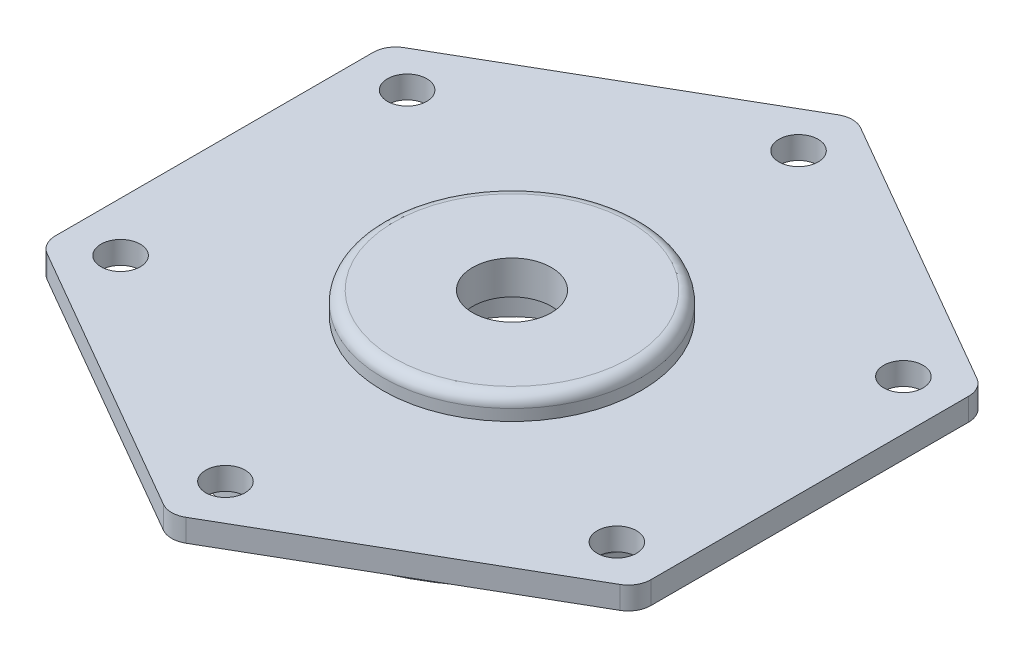
ISO-10303-21;
HEADER;
FILE_DESCRIPTION(('STEP AP214'),'2;1');
FILE_NAME('part.step','',(''),(''),'','','');
FILE_SCHEMA(('AUTOMOTIVE_DESIGN { 1 0 10303 214 1 1 1 1 }'));
ENDSEC;
DATA;
#1=APPLICATION_CONTEXT('core data for automotive mechanical design processes');
#2=APPLICATION_PROTOCOL_DEFINITION('international standard','automotive_design',2000,#1);
#3=PRODUCT_CONTEXT('',#1,'mechanical');
#4=PRODUCT('Part','Part','',(#3));
#5=PRODUCT_RELATED_PRODUCT_CATEGORY('part','',(#4));
#6=PRODUCT_DEFINITION_FORMATION('','',#4);
#7=PRODUCT_DEFINITION_CONTEXT('part definition',#1,'design');
#8=PRODUCT_DEFINITION('design','',#6,#7);
#9=PRODUCT_DEFINITION_SHAPE('','',#8);
#10=(LENGTH_UNIT() NAMED_UNIT(*) SI_UNIT(.MILLI.,.METRE.));
#11=(NAMED_UNIT(*) PLANE_ANGLE_UNIT() SI_UNIT($,.RADIAN.));
#12=(NAMED_UNIT(*) SI_UNIT($,.STERADIAN.) SOLID_ANGLE_UNIT());
#13=UNCERTAINTY_MEASURE_WITH_UNIT(LENGTH_MEASURE(1.E-05),#10,'distance_accuracy_value','');
#14=(GEOMETRIC_REPRESENTATION_CONTEXT(3) GLOBAL_UNCERTAINTY_ASSIGNED_CONTEXT((#13)) GLOBAL_UNIT_ASSIGNED_CONTEXT((#10,
#11,#12)) REPRESENTATION_CONTEXT('',''));
#15=CARTESIAN_POINT('',(0.,0.,0.));
#16=DIRECTION('',(0.,0.,1.));
#17=DIRECTION('',(1.,0.,0.));
#18=AXIS2_PLACEMENT_3D('',#15,#16,#17);
#19=CARTESIAN_POINT('',(-49.,4.,28.2901631902916));
#20=DIRECTION('',(0.,-1.,0.));
#21=DIRECTION('',(0.,0.,-1.));
#22=AXIS2_PLACEMENT_3D('',#19,#20,#21);
#23=CYLINDRICAL_SURFACE('',#22,4.);
#24=CARTESIAN_POINT('',(-49.,0.,28.2901631902916));
#25=DIRECTION('',(0.,1.,0.));
#26=DIRECTION('',(0.,0.,-1.));
#27=AXIS2_PLACEMENT_3D('',#24,#25,#26);
#28=CIRCLE('',#27,4.);
#29=CARTESIAN_POINT('',(-53.,0.,28.2901631902916));
#30=VERTEX_POINT('',#29);
#31=CARTESIAN_POINT('',(-51.,0.,31.7542648054294));
#32=VERTEX_POINT('',#31);
#33=EDGE_CURVE('E161',#30,#32,#28,.T.);
#34=ORIENTED_EDGE('',*,*,#33,.T.);
#35=DIRECTION('',(0.,-1.,0.));
#36=VECTOR('',#35,1.);
#37=CARTESIAN_POINT('',(-51.,4.,31.7542648054294));
#38=LINE('',#37,#36);
#39=CARTESIAN_POINT('',(-51.,4.,31.7542648054294));
#40=VERTEX_POINT('',#39);
#41=EDGE_CURVE('E209',#40,#32,#38,.T.);
#42=ORIENTED_EDGE('',*,*,#41,.F.);
#43=CARTESIAN_POINT('',(-49.,4.,28.2901631902916));
#44=DIRECTION('',(0.,1.,0.));
#45=DIRECTION('',(0.,0.,-1.));
#46=AXIS2_PLACEMENT_3D('',#43,#44,#45);
#47=CIRCLE('',#46,4.);
#48=CARTESIAN_POINT('',(-53.,4.,28.2901631902916));
#49=VERTEX_POINT('',#48);
#50=EDGE_CURVE('E184',#49,#40,#47,.T.);
#51=ORIENTED_EDGE('',*,*,#50,.F.);
#52=DIRECTION('',(0.,-1.,0.));
#53=VECTOR('',#52,1.);
#54=CARTESIAN_POINT('',(-53.,4.,28.2901631902916));
#55=LINE('',#54,#53);
#56=EDGE_CURVE('E157',#49,#30,#55,.T.);
#57=ORIENTED_EDGE('',*,*,#56,.T.);
#58=EDGE_LOOP('',(#34,#42,#51,#57));
#59=FACE_BOUND('',#58,.T.);
#60=ADVANCED_FACE('F37',(#59),#23,.T.);
#61=CARTESIAN_POINT('',(-51.,4.,31.7542648054294));
#62=DIRECTION('',(0.5,0.,-0.866025403784439));
#63=DIRECTION('',(-0.866025403784439,0.,-0.5));
#64=AXIS2_PLACEMENT_3D('',#61,#62,#63);
#65=PLANE('',#64);
#66=DIRECTION('',(0.866025403784438,0.,0.5));
#67=VECTOR('',#66,1.);
#68=CARTESIAN_POINT('',(-51.,0.,31.7542648054294));
#69=LINE('',#68,#67);
#70=CARTESIAN_POINT('',(-2.00000000000003,0.,60.0444279957211));
#71=VERTEX_POINT('',#70);
#72=EDGE_CURVE('E164',#32,#71,#69,.T.);
#73=ORIENTED_EDGE('',*,*,#72,.T.);
#74=DIRECTION('',(0.,-1.,0.));
#75=VECTOR('',#74,1.);
#76=CARTESIAN_POINT('',(-2.00000000000003,4.,60.0444279957211));
#77=LINE('',#76,#75);
#78=CARTESIAN_POINT('',(-2.00000000000003,4.,60.0444279957211));
#79=VERTEX_POINT('',#78);
#80=EDGE_CURVE('E206',#79,#71,#77,.T.);
#81=ORIENTED_EDGE('',*,*,#80,.F.);
#82=DIRECTION('',(0.866025403784438,0.,0.5));
#83=VECTOR('',#82,1.);
#84=CARTESIAN_POINT('',(-51.,4.,31.7542648054294));
#85=LINE('',#84,#83);
#86=EDGE_CURVE('E112',#40,#79,#85,.T.);
#87=ORIENTED_EDGE('',*,*,#86,.F.);
#88=ORIENTED_EDGE('',*,*,#41,.T.);
#89=EDGE_LOOP('',(#73,#81,#87,#88));
#90=FACE_BOUND('',#89,.T.);
#91=ADVANCED_FACE('F316',(#90),#65,.F.);
#92=CARTESIAN_POINT('',(0.,4.,56.5803263805833));
#93=DIRECTION('',(0.,-1.,0.));
#94=DIRECTION('',(0.,0.,-1.));
#95=AXIS2_PLACEMENT_3D('',#92,#93,#94);
#96=CYLINDRICAL_SURFACE('',#95,4.);
#97=CARTESIAN_POINT('',(0.,0.,56.5803263805833));
#98=DIRECTION('',(0.,1.,0.));
#99=DIRECTION('',(0.,0.,1.));
#100=AXIS2_PLACEMENT_3D('',#97,#98,#99);
#101=CIRCLE('',#100,4.);
#102=CARTESIAN_POINT('',(2.,0.,60.0444279957211));
#103=VERTEX_POINT('',#102);
#104=EDGE_CURVE('E167',#71,#103,#101,.T.);
#105=ORIENTED_EDGE('',*,*,#104,.T.);
#106=DIRECTION('',(0.,-1.,0.));
#107=VECTOR('',#106,1.);
#108=CARTESIAN_POINT('',(2.,4.,60.0444279957211));
#109=LINE('',#108,#107);
#110=CARTESIAN_POINT('',(2.,4.,60.0444279957211));
#111=VERTEX_POINT('',#110);
#112=EDGE_CURVE('E203',#111,#103,#109,.T.);
#113=ORIENTED_EDGE('',*,*,#112,.F.);
#114=CARTESIAN_POINT('',(0.,4.,56.5803263805833));
#115=DIRECTION('',(0.,1.,0.));
#116=DIRECTION('',(0.,0.,1.));
#117=AXIS2_PLACEMENT_3D('',#114,#115,#116);
#118=CIRCLE('',#117,4.);
#119=EDGE_CURVE('E276',#79,#111,#118,.T.);
#120=ORIENTED_EDGE('',*,*,#119,.F.);
#121=ORIENTED_EDGE('',*,*,#80,.T.);
#122=EDGE_LOOP('',(#105,#113,#120,#121));
#123=FACE_BOUND('',#122,.T.);
#124=ADVANCED_FACE('F321',(#123),#96,.T.);
#125=CARTESIAN_POINT('',(2.,4.,60.0444279957211));
#126=DIRECTION('',(-0.5,0.,-0.866025403784439));
#127=DIRECTION('',(-0.866025403784439,0.,0.5));
#128=AXIS2_PLACEMENT_3D('',#125,#126,#127);
#129=PLANE('',#128);
#130=DIRECTION('',(0.866025403784439,0.,-0.5));
#131=VECTOR('',#130,1.);
#132=CARTESIAN_POINT('',(2.,0.,60.0444279957211));
#133=LINE('',#132,#131);
#134=CARTESIAN_POINT('',(51.,0.,31.7542648054295));
#135=VERTEX_POINT('',#134);
#136=EDGE_CURVE('E169',#103,#135,#133,.T.);
#137=ORIENTED_EDGE('',*,*,#136,.T.);
#138=DIRECTION('',(0.,-1.,0.));
#139=VECTOR('',#138,1.);
#140=CARTESIAN_POINT('',(51.,4.,31.7542648054295));
#141=LINE('',#140,#139);
#142=CARTESIAN_POINT('',(51.,4.,31.7542648054295));
#143=VERTEX_POINT('',#142);
#144=EDGE_CURVE('E200',#143,#135,#141,.T.);
#145=ORIENTED_EDGE('',*,*,#144,.F.);
#146=DIRECTION('',(0.866025403784439,0.,-0.5));
#147=VECTOR('',#146,1.);
#148=CARTESIAN_POINT('',(2.,4.,60.0444279957211));
#149=LINE('',#148,#147);
#150=EDGE_CURVE('E278',#111,#143,#149,.T.);
#151=ORIENTED_EDGE('',*,*,#150,.F.);
#152=ORIENTED_EDGE('',*,*,#112,.T.);
#153=EDGE_LOOP('',(#137,#145,#151,#152));
#154=FACE_BOUND('',#153,.T.);
#155=ADVANCED_FACE('F678',(#154),#129,.F.);
#156=CARTESIAN_POINT('',(49.,4.,28.2901631902917));
#157=DIRECTION('',(0.,-1.,0.));
#158=DIRECTION('',(0.,0.,-1.));
#159=AXIS2_PLACEMENT_3D('',#156,#157,#158);
#160=CYLINDRICAL_SURFACE('',#159,4.);
#161=CARTESIAN_POINT('',(49.,0.,28.2901631902917));
#162=DIRECTION('',(0.,1.,0.));
#163=DIRECTION('',(0.,0.,1.));
#164=AXIS2_PLACEMENT_3D('',#161,#162,#163);
#165=CIRCLE('',#164,4.);
#166=CARTESIAN_POINT('',(53.,0.,28.2901631902917));
#167=VERTEX_POINT('',#166);
#168=EDGE_CURVE('E171',#135,#167,#165,.T.);
#169=ORIENTED_EDGE('',*,*,#168,.T.);
#170=DIRECTION('',(0.,-1.,0.));
#171=VECTOR('',#170,1.);
#172=CARTESIAN_POINT('',(53.,4.,28.2901631902917));
#173=LINE('',#172,#171);
#174=CARTESIAN_POINT('',(53.,4.,28.2901631902917));
#175=VERTEX_POINT('',#174);
#176=EDGE_CURVE('E197',#175,#167,#173,.T.);
#177=ORIENTED_EDGE('',*,*,#176,.F.);
#178=CARTESIAN_POINT('',(49.,4.,28.2901631902917));
#179=DIRECTION('',(0.,1.,0.));
#180=DIRECTION('',(0.,0.,1.));
#181=AXIS2_PLACEMENT_3D('',#178,#179,#180);
#182=CIRCLE('',#181,4.);
#183=EDGE_CURVE('E280',#143,#175,#182,.T.);
#184=ORIENTED_EDGE('',*,*,#183,.F.);
#185=ORIENTED_EDGE('',*,*,#144,.T.);
#186=EDGE_LOOP('',(#169,#177,#184,#185));
#187=FACE_BOUND('',#186,.T.);
#188=ADVANCED_FACE('F668',(#187),#160,.T.);
#189=CARTESIAN_POINT('',(53.,4.,28.2901631902917));
#190=DIRECTION('',(-1.,0.,0.));
#191=DIRECTION('',(0.,0.,1.));
#192=AXIS2_PLACEMENT_3D('',#189,#190,#191);
#193=PLANE('',#192);
#194=DIRECTION('',(0.,0.,-1.));
#195=VECTOR('',#194,1.);
#196=CARTESIAN_POINT('',(53.,0.,28.2901631902917));
#197=LINE('',#196,#195);
#198=CARTESIAN_POINT('',(53.,0.,-28.2901631902916));
#199=VERTEX_POINT('',#198);
#200=EDGE_CURVE('E173',#167,#199,#197,.T.);
#201=ORIENTED_EDGE('',*,*,#200,.T.);
#202=DIRECTION('',(0.,-1.,0.));
#203=VECTOR('',#202,1.);
#204=CARTESIAN_POINT('',(53.,4.,-28.2901631902916));
#205=LINE('',#204,#203);
#206=CARTESIAN_POINT('',(53.,4.,-28.2901631902916));
#207=VERTEX_POINT('',#206);
#208=EDGE_CURVE('E194',#207,#199,#205,.T.);
#209=ORIENTED_EDGE('',*,*,#208,.F.);
#210=DIRECTION('',(0.,0.,-1.));
#211=VECTOR('',#210,1.);
#212=CARTESIAN_POINT('',(53.,4.,28.2901631902917));
#213=LINE('',#212,#211);
#214=EDGE_CURVE('E282',#175,#207,#213,.T.);
#215=ORIENTED_EDGE('',*,*,#214,.F.);
#216=ORIENTED_EDGE('',*,*,#176,.T.);
#217=EDGE_LOOP('',(#201,#209,#215,#216));
#218=FACE_BOUND('',#217,.T.);
#219=ADVANCED_FACE('F658',(#218),#193,.F.);
#220=CARTESIAN_POINT('',(49.,4.,-28.2901631902917));
#221=DIRECTION('',(0.,-1.,0.));
#222=DIRECTION('',(0.,0.,-1.));
#223=AXIS2_PLACEMENT_3D('',#220,#221,#222);
#224=CYLINDRICAL_SURFACE('',#223,4.);
#225=CARTESIAN_POINT('',(49.,0.,-28.2901631902917));
#226=DIRECTION('',(0.,1.,0.));
#227=DIRECTION('',(0.,0.,1.));
#228=AXIS2_PLACEMENT_3D('',#225,#226,#227);
#229=CIRCLE('',#228,4.);
#230=CARTESIAN_POINT('',(51.,0.,-31.7542648054294));
#231=VERTEX_POINT('',#230);
#232=EDGE_CURVE('E175',#199,#231,#229,.T.);
#233=ORIENTED_EDGE('',*,*,#232,.T.);
#234=DIRECTION('',(0.,-1.,0.));
#235=VECTOR('',#234,1.);
#236=CARTESIAN_POINT('',(51.,4.,-31.7542648054294));
#237=LINE('',#236,#235);
#238=CARTESIAN_POINT('',(51.,4.,-31.7542648054294));
#239=VERTEX_POINT('',#238);
#240=EDGE_CURVE('E191',#239,#231,#237,.T.);
#241=ORIENTED_EDGE('',*,*,#240,.F.);
#242=CARTESIAN_POINT('',(49.,4.,-28.2901631902917));
#243=DIRECTION('',(0.,1.,0.));
#244=DIRECTION('',(0.,0.,1.));
#245=AXIS2_PLACEMENT_3D('',#242,#243,#244);
#246=CIRCLE('',#245,4.);
#247=EDGE_CURVE('E284',#207,#239,#246,.T.);
#248=ORIENTED_EDGE('',*,*,#247,.F.);
#249=ORIENTED_EDGE('',*,*,#208,.T.);
#250=EDGE_LOOP('',(#233,#241,#248,#249));
#251=FACE_BOUND('',#250,.T.);
#252=ADVANCED_FACE('F649',(#251),#224,.T.);
#253=CARTESIAN_POINT('',(51.,4.,-31.7542648054294));
#254=DIRECTION('',(-0.5,0.,0.866025403784438));
#255=DIRECTION('',(0.866025403784438,0.,0.5));
#256=AXIS2_PLACEMENT_3D('',#253,#254,#255);
#257=PLANE('',#256);
#258=DIRECTION('',(-0.866025403784438,0.,-0.5));
#259=VECTOR('',#258,1.);
#260=CARTESIAN_POINT('',(51.,0.,-31.7542648054294));
#261=LINE('',#260,#259);
#262=CARTESIAN_POINT('',(2.00000000000002,0.,-60.0444279957211));
#263=VERTEX_POINT('',#262);
#264=EDGE_CURVE('E177',#231,#263,#261,.T.);
#265=ORIENTED_EDGE('',*,*,#264,.T.);
#266=DIRECTION('',(0.,-1.,0.));
#267=VECTOR('',#266,1.);
#268=CARTESIAN_POINT('',(2.00000000000002,4.,-60.0444279957211));
#269=LINE('',#268,#267);
#270=CARTESIAN_POINT('',(2.00000000000002,4.,-60.0444279957211));
#271=VERTEX_POINT('',#270);
#272=EDGE_CURVE('E188',#271,#263,#269,.T.);
#273=ORIENTED_EDGE('',*,*,#272,.F.);
#274=DIRECTION('',(-0.866025403784438,0.,-0.5));
#275=VECTOR('',#274,1.);
#276=CARTESIAN_POINT('',(51.,4.,-31.7542648054294));
#277=LINE('',#276,#275);
#278=EDGE_CURVE('E286',#239,#271,#277,.T.);
#279=ORIENTED_EDGE('',*,*,#278,.F.);
#280=ORIENTED_EDGE('',*,*,#240,.T.);
#281=EDGE_LOOP('',(#265,#273,#279,#280));
#282=FACE_BOUND('',#281,.T.);
#283=ADVANCED_FACE('F292',(#282),#257,.F.);
#284=CARTESIAN_POINT('',(0.,4.,-56.5803263805833));
#285=DIRECTION('',(0.,-1.,0.));
#286=DIRECTION('',(0.,0.,-1.));
#287=AXIS2_PLACEMENT_3D('',#284,#285,#286);
#288=CYLINDRICAL_SURFACE('',#287,4.00000000000001);
#289=CARTESIAN_POINT('',(0.,0.,-56.5803263805833));
#290=DIRECTION('',(0.,1.,0.));
#291=DIRECTION('',(0.,0.,1.));
#292=AXIS2_PLACEMENT_3D('',#289,#290,#291);
#293=CIRCLE('',#292,4.00000000000001);
#294=CARTESIAN_POINT('',(-2.00000000000002,0.,-60.0444279957211));
#295=VERTEX_POINT('',#294);
#296=EDGE_CURVE('E179',#263,#295,#293,.T.);
#297=ORIENTED_EDGE('',*,*,#296,.T.);
#298=DIRECTION('',(0.,-1.,0.));
#299=VECTOR('',#298,1.);
#300=CARTESIAN_POINT('',(-2.00000000000002,4.,-60.0444279957211));
#301=LINE('',#300,#299);
#302=CARTESIAN_POINT('',(-2.00000000000002,4.,-60.0444279957211));
#303=VERTEX_POINT('',#302);
#304=EDGE_CURVE('E152',#303,#295,#301,.T.);
#305=ORIENTED_EDGE('',*,*,#304,.F.);
#306=CARTESIAN_POINT('',(0.,4.,-56.5803263805833));
#307=DIRECTION('',(0.,1.,0.));
#308=DIRECTION('',(0.,0.,1.));
#309=AXIS2_PLACEMENT_3D('',#306,#307,#308);
#310=CIRCLE('',#309,4.00000000000001);
#311=EDGE_CURVE('E143',#271,#303,#310,.T.);
#312=ORIENTED_EDGE('',*,*,#311,.F.);
#313=ORIENTED_EDGE('',*,*,#272,.T.);
#314=EDGE_LOOP('',(#297,#305,#312,#313));
#315=FACE_BOUND('',#314,.T.);
#316=ADVANCED_FACE('F296',(#315),#288,.T.);
#317=CARTESIAN_POINT('',(-2.00000000000002,4.,-60.0444279957211));
#318=DIRECTION('',(0.5,0.,0.866025403784439));
#319=DIRECTION('',(0.866025403784439,0.,-0.5));
#320=AXIS2_PLACEMENT_3D('',#317,#318,#319);
#321=PLANE('',#320);
#322=DIRECTION('',(-0.866025403784439,0.,0.5));
#323=VECTOR('',#322,1.);
#324=CARTESIAN_POINT('',(-2.00000000000002,0.,-60.0444279957211));
#325=LINE('',#324,#323);
#326=CARTESIAN_POINT('',(-51.,0.,-31.7542648054295));
#327=VERTEX_POINT('',#326);
#328=EDGE_CURVE('E151',#295,#327,#325,.T.);
#329=ORIENTED_EDGE('',*,*,#328,.T.);
#330=DIRECTION('',(0.,-1.,0.));
#331=VECTOR('',#330,1.);
#332=CARTESIAN_POINT('',(-51.,4.,-31.7542648054295));
#333=LINE('',#332,#331);
#334=CARTESIAN_POINT('',(-51.,4.,-31.7542648054295));
#335=VERTEX_POINT('',#334);
#336=EDGE_CURVE('E148',#335,#327,#333,.T.);
#337=ORIENTED_EDGE('',*,*,#336,.F.);
#338=DIRECTION('',(-0.866025403784439,0.,0.5));
#339=VECTOR('',#338,1.);
#340=CARTESIAN_POINT('',(-2.00000000000002,4.,-60.0444279957211));
#341=LINE('',#340,#339);
#342=EDGE_CURVE('E137',#303,#335,#341,.T.);
#343=ORIENTED_EDGE('',*,*,#342,.F.);
#344=ORIENTED_EDGE('',*,*,#304,.T.);
#345=EDGE_LOOP('',(#329,#337,#343,#344));
#346=FACE_BOUND('',#345,.T.);
#347=ADVANCED_FACE('F149',(#346),#321,.F.);
#348=CARTESIAN_POINT('',(-49.,4.,-28.2901631902917));
#349=DIRECTION('',(0.,-1.,0.));
#350=DIRECTION('',(0.,0.,-1.));
#351=AXIS2_PLACEMENT_3D('',#348,#349,#350);
#352=CYLINDRICAL_SURFACE('',#351,4.);
#353=CARTESIAN_POINT('',(-49.,0.,-28.2901631902917));
#354=DIRECTION('',(0.,1.,0.));
#355=DIRECTION('',(0.,0.,1.));
#356=AXIS2_PLACEMENT_3D('',#353,#354,#355);
#357=CIRCLE('',#356,4.);
#358=CARTESIAN_POINT('',(-53.,0.,-28.2901631902917));
#359=VERTEX_POINT('',#358);
#360=EDGE_CURVE('E97',#327,#359,#357,.T.);
#361=ORIENTED_EDGE('',*,*,#360,.T.);
#362=DIRECTION('',(0.,-1.,0.));
#363=VECTOR('',#362,1.);
#364=CARTESIAN_POINT('',(-53.,4.,-28.2901631902917));
#365=LINE('',#364,#363);
#366=CARTESIAN_POINT('',(-53.,4.,-28.2901631902917));
#367=VERTEX_POINT('',#366);
#368=EDGE_CURVE('E153',#367,#359,#365,.T.);
#369=ORIENTED_EDGE('',*,*,#368,.F.);
#370=CARTESIAN_POINT('',(-49.,4.,-28.2901631902917));
#371=DIRECTION('',(0.,1.,0.));
#372=DIRECTION('',(0.,0.,1.));
#373=AXIS2_PLACEMENT_3D('',#370,#371,#372);
#374=CIRCLE('',#373,4.);
#375=EDGE_CURVE('E141',#335,#367,#374,.T.);
#376=ORIENTED_EDGE('',*,*,#375,.F.);
#377=ORIENTED_EDGE('',*,*,#336,.T.);
#378=EDGE_LOOP('',(#361,#369,#376,#377));
#379=FACE_BOUND('',#378,.T.);
#380=ADVANCED_FACE('F155',(#379),#352,.T.);
#381=CARTESIAN_POINT('',(-53.,4.,-28.2901631902917));
#382=DIRECTION('',(1.,0.,0.));
#383=DIRECTION('',(0.,0.,-1.));
#384=AXIS2_PLACEMENT_3D('',#381,#382,#383);
#385=PLANE('',#384);
#386=DIRECTION('',(0.,0.,1.));
#387=VECTOR('',#386,1.);
#388=CARTESIAN_POINT('',(-53.,0.,-28.2901631902917));
#389=LINE('',#388,#387);
#390=EDGE_CURVE('E103',#359,#30,#389,.T.);
#391=ORIENTED_EDGE('',*,*,#390,.T.);
#392=ORIENTED_EDGE('',*,*,#56,.F.);
#393=DIRECTION('',(0.,0.,1.));
#394=VECTOR('',#393,1.);
#395=CARTESIAN_POINT('',(-53.,4.,-28.2901631902917));
#396=LINE('',#395,#394);
#397=EDGE_CURVE('E56',#367,#49,#396,.T.);
#398=ORIENTED_EDGE('',*,*,#397,.F.);
#399=ORIENTED_EDGE('',*,*,#368,.T.);
#400=EDGE_LOOP('',(#391,#392,#398,#399));
#401=FACE_BOUND('',#400,.T.);
#402=ADVANCED_FACE('F304',(#401),#385,.F.);
#403=CARTESIAN_POINT('',(-49.,4.,28.2901631902916));
#404=DIRECTION('',(0.,-1.,0.));
#405=DIRECTION('',(0.,0.,-1.));
#406=AXIS2_PLACEMENT_3D('',#403,#404,#405);
#407=PLANE('',#406);
#408=CARTESIAN_POINT('',(0.,4.,-51.));
#409=DIRECTION('',(0.,1.,0.));
#410=DIRECTION('',(0.,0.,1.));
#411=AXIS2_PLACEMENT_3D('',#408,#409,#410);
#412=CIRCLE('',#411,3.5);
#413=CARTESIAN_POINT('',(0.,4.,-47.5));
#414=VERTEX_POINT('',#413);
#415=EDGE_CURVE('E230',#414,#414,#412,.T.);
#416=ORIENTED_EDGE('',*,*,#415,.F.);
#417=EDGE_LOOP('',(#416));
#418=FACE_BOUND('',#417,.T.);
#419=CARTESIAN_POINT('',(-44.1672955930053,4.,-25.4999999999981));
#420=DIRECTION('',(0.,1.,0.));
#421=DIRECTION('',(0.,0.,1.));
#422=AXIS2_PLACEMENT_3D('',#419,#420,#421);
#423=CIRCLE('',#422,3.50000000000219);
#424=CARTESIAN_POINT('',(-44.1672955930053,4.,-21.9999999999959));
#425=VERTEX_POINT('',#424);
#426=EDGE_CURVE('E423',#425,#425,#423,.T.);
#427=ORIENTED_EDGE('',*,*,#426,.F.);
#428=EDGE_LOOP('',(#427));
#429=FACE_BOUND('',#428,.T.);
#430=CARTESIAN_POINT('',(-44.1672955930031,4.,25.5000000000019));
#431=DIRECTION('',(0.,1.,0.));
#432=DIRECTION('',(0.,0.,1.));
#433=AXIS2_PLACEMENT_3D('',#430,#431,#432);
#434=CIRCLE('',#433,3.50000000000413);
#435=CARTESIAN_POINT('',(-44.1672955930031,4.,29.000000000006));
#436=VERTEX_POINT('',#435);
#437=EDGE_CURVE('E426',#436,#436,#434,.T.);
#438=ORIENTED_EDGE('',*,*,#437,.F.);
#439=EDGE_LOOP('',(#438));
#440=FACE_BOUND('',#439,.T.);
#441=CARTESIAN_POINT('',(4.32978444682486E-12,4.,51.));
#442=DIRECTION('',(0.,1.,0.));
#443=DIRECTION('',(0.,0.,1.));
#444=AXIS2_PLACEMENT_3D('',#441,#442,#443);
#445=CIRCLE('',#444,3.50000000000448);
#446=CARTESIAN_POINT('',(4.32978444682486E-12,4.,54.5000000000045));
#447=VERTEX_POINT('',#446);
#448=EDGE_CURVE('E420',#447,#447,#445,.T.);
#449=ORIENTED_EDGE('',*,*,#448,.F.);
#450=EDGE_LOOP('',(#449));
#451=FACE_BOUND('',#450,.T.);
#452=CARTESIAN_POINT('',(44.1672955930096,4.,25.4999999999981));
#453=DIRECTION('',(0.,1.,0.));
#454=DIRECTION('',(0.,0.,1.));
#455=AXIS2_PLACEMENT_3D('',#452,#453,#454);
#456=CIRCLE('',#455,3.50000000000279);
#457=CARTESIAN_POINT('',(44.1672955930096,4.,29.0000000000009));
#458=VERTEX_POINT('',#457);
#459=EDGE_CURVE('E415',#458,#458,#456,.T.);
#460=ORIENTED_EDGE('',*,*,#459,.F.);
#461=EDGE_LOOP('',(#460));
#462=FACE_BOUND('',#461,.T.);
#463=CARTESIAN_POINT('',(44.1672955930074,4.,-25.5000000000019));
#464=DIRECTION('',(0.,1.,0.));
#465=DIRECTION('',(0.,0.,1.));
#466=AXIS2_PLACEMENT_3D('',#463,#464,#465);
#467=CIRCLE('',#466,3.50000000000063);
#468=CARTESIAN_POINT('',(44.1672955930074,4.,-22.0000000000013));
#469=VERTEX_POINT('',#468);
#470=EDGE_CURVE('E413',#469,#469,#467,.T.);
#471=ORIENTED_EDGE('',*,*,#470,.F.);
#472=EDGE_LOOP('',(#471));
#473=FACE_BOUND('',#472,.T.);
#474=CARTESIAN_POINT('',(0.,4.,0.));
#475=DIRECTION('',(0.,1.,0.));
#476=DIRECTION('',(0.,0.,1.));
#477=AXIS2_PLACEMENT_3D('',#474,#475,#476);
#478=CIRCLE('',#477,23.);
#479=CARTESIAN_POINT('',(0.,4.,23.));
#480=VERTEX_POINT('',#479);
#481=EDGE_CURVE('E211',#480,#480,#478,.T.);
#482=ORIENTED_EDGE('',*,*,#481,.F.);
#483=EDGE_LOOP('',(#482));
#484=FACE_BOUND('',#483,.T.);
#485=ORIENTED_EDGE('',*,*,#50,.T.);
#486=ORIENTED_EDGE('',*,*,#86,.T.);
#487=ORIENTED_EDGE('',*,*,#119,.T.);
#488=ORIENTED_EDGE('',*,*,#150,.T.);
#489=ORIENTED_EDGE('',*,*,#183,.T.);
#490=ORIENTED_EDGE('',*,*,#214,.T.);
#491=ORIENTED_EDGE('',*,*,#247,.T.);
#492=ORIENTED_EDGE('',*,*,#278,.T.);
#493=ORIENTED_EDGE('',*,*,#311,.T.);
#494=ORIENTED_EDGE('',*,*,#342,.T.);
#495=ORIENTED_EDGE('',*,*,#375,.T.);
#496=ORIENTED_EDGE('',*,*,#397,.T.);
#497=EDGE_LOOP('',(#485,#486,#487,#488,#489,#490,#491,#492,#493,#494,#495,#496));
#498=FACE_BOUND('',#497,.T.);
#499=ADVANCED_FACE('F139',(#418,#429,#440,#451,#462,#473,#484,#498),#407,.F.);
#500=CARTESIAN_POINT('',(-49.,0.,28.2901631902916));
#501=DIRECTION('',(0.,-1.,0.));
#502=DIRECTION('',(0.,0.,-1.));
#503=AXIS2_PLACEMENT_3D('',#500,#501,#502);
#504=PLANE('',#503);
#505=CARTESIAN_POINT('',(0.,0.,-51.));
#506=DIRECTION('',(0.,-1.,0.));
#507=DIRECTION('',(0.,0.,-1.));
#508=AXIS2_PLACEMENT_3D('',#505,#506,#507);
#509=CIRCLE('',#508,3.5);
#510=CARTESIAN_POINT('',(0.,0.,-54.5));
#511=VERTEX_POINT('',#510);
#512=EDGE_CURVE('E41',#511,#511,#509,.T.);
#513=ORIENTED_EDGE('',*,*,#512,.F.);
#514=EDGE_LOOP('',(#513));
#515=FACE_BOUND('',#514,.T.);
#516=CARTESIAN_POINT('',(-44.1672955930053,0.,-25.4999999999981));
#517=DIRECTION('',(0.,-1.,0.));
#518=DIRECTION('',(0.,0.,-1.));
#519=AXIS2_PLACEMENT_3D('',#516,#517,#518);
#520=CIRCLE('',#519,3.50000000000219);
#521=CARTESIAN_POINT('',(-44.1672955930053,0.,-29.0000000000003));
#522=VERTEX_POINT('',#521);
#523=EDGE_CURVE('E238',#522,#522,#520,.T.);
#524=ORIENTED_EDGE('',*,*,#523,.F.);
#525=EDGE_LOOP('',(#524));
#526=FACE_BOUND('',#525,.T.);
#527=CARTESIAN_POINT('',(-44.1672955930031,0.,25.5000000000019));
#528=DIRECTION('',(0.,-1.,0.));
#529=DIRECTION('',(0.,0.,-1.));
#530=AXIS2_PLACEMENT_3D('',#527,#528,#529);
#531=CIRCLE('',#530,3.50000000000413);
#532=CARTESIAN_POINT('',(-44.1672955930031,0.,21.9999999999978));
#533=VERTEX_POINT('',#532);
#534=EDGE_CURVE('E236',#533,#533,#531,.T.);
#535=ORIENTED_EDGE('',*,*,#534,.F.);
#536=EDGE_LOOP('',(#535));
#537=FACE_BOUND('',#536,.T.);
#538=CARTESIAN_POINT('',(4.32978444682486E-12,0.,51.));
#539=DIRECTION('',(0.,-1.,0.));
#540=DIRECTION('',(0.,0.,-1.));
#541=AXIS2_PLACEMENT_3D('',#538,#539,#540);
#542=CIRCLE('',#541,3.50000000000448);
#543=CARTESIAN_POINT('',(4.32978444682486E-12,0.,47.4999999999955));
#544=VERTEX_POINT('',#543);
#545=EDGE_CURVE('E233',#544,#544,#542,.T.);
#546=ORIENTED_EDGE('',*,*,#545,.F.);
#547=EDGE_LOOP('',(#546));
#548=FACE_BOUND('',#547,.T.);
#549=CARTESIAN_POINT('',(44.1672955930096,0.,25.4999999999981));
#550=DIRECTION('',(0.,-1.,0.));
#551=DIRECTION('',(0.,0.,-1.));
#552=AXIS2_PLACEMENT_3D('',#549,#550,#551);
#553=CIRCLE('',#552,3.50000000000279);
#554=CARTESIAN_POINT('',(44.1672955930096,0.,21.9999999999953));
#555=VERTEX_POINT('',#554);
#556=EDGE_CURVE('E229',#555,#555,#553,.T.);
#557=ORIENTED_EDGE('',*,*,#556,.F.);
#558=EDGE_LOOP('',(#557));
#559=FACE_BOUND('',#558,.T.);
#560=CARTESIAN_POINT('',(44.1672955930074,0.,-25.5000000000019));
#561=DIRECTION('',(0.,-1.,0.));
#562=DIRECTION('',(0.,0.,-1.));
#563=AXIS2_PLACEMENT_3D('',#560,#561,#562);
#564=CIRCLE('',#563,3.50000000000063);
#565=CARTESIAN_POINT('',(44.1672955930074,0.,-29.0000000000025));
#566=VERTEX_POINT('',#565);
#567=EDGE_CURVE('E226',#566,#566,#564,.T.);
#568=ORIENTED_EDGE('',*,*,#567,.F.);
#569=EDGE_LOOP('',(#568));
#570=FACE_BOUND('',#569,.T.);
#571=CARTESIAN_POINT('',(0.,0.,0.));
#572=DIRECTION('',(0.,-1.,0.));
#573=DIRECTION('',(0.,0.,-1.));
#574=AXIS2_PLACEMENT_3D('',#571,#572,#573);
#575=CIRCLE('',#574,47.);
#576=CARTESIAN_POINT('',(0.,0.,-47.));
#577=VERTEX_POINT('',#576);
#578=EDGE_CURVE('E11',#577,#577,#575,.F.);
#579=ORIENTED_EDGE('',*,*,#578,.T.);
#580=EDGE_LOOP('',(#579));
#581=FACE_BOUND('',#580,.T.);
#582=ORIENTED_EDGE('',*,*,#33,.F.);
#583=ORIENTED_EDGE('',*,*,#390,.F.);
#584=ORIENTED_EDGE('',*,*,#360,.F.);
#585=ORIENTED_EDGE('',*,*,#328,.F.);
#586=ORIENTED_EDGE('',*,*,#296,.F.);
#587=ORIENTED_EDGE('',*,*,#264,.F.);
#588=ORIENTED_EDGE('',*,*,#232,.F.);
#589=ORIENTED_EDGE('',*,*,#200,.F.);
#590=ORIENTED_EDGE('',*,*,#168,.F.);
#591=ORIENTED_EDGE('',*,*,#136,.F.);
#592=ORIENTED_EDGE('',*,*,#104,.F.);
#593=ORIENTED_EDGE('',*,*,#72,.F.);
#594=EDGE_LOOP('',(#582,#583,#584,#585,#586,#587,#588,#589,#590,#591,#592,#593));
#595=FACE_BOUND('',#594,.T.);
#596=ADVANCED_FACE('F299',(#515,#526,#537,#548,#559,#570,#581,#595),#504,.T.);
#597=CARTESIAN_POINT('',(0.,8.,0.));
#598=DIRECTION('',(0.,-1.,0.));
#599=DIRECTION('',(0.,0.,-1.));
#600=AXIS2_PLACEMENT_3D('',#597,#598,#599);
#601=CYLINDRICAL_SURFACE('',#600,23.);
#602=CARTESIAN_POINT('',(0.,6.,0.));
#603=DIRECTION('',(0.,1.,0.));
#604=DIRECTION('',(0.,0.,1.));
#605=AXIS2_PLACEMENT_3D('',#602,#603,#604);
#606=CIRCLE('',#605,23.);
#607=CARTESIAN_POINT('',(0.,6.,23.));
#608=VERTEX_POINT('',#607);
#609=EDGE_CURVE('E215',#608,#608,#606,.F.);
#610=ORIENTED_EDGE('',*,*,#609,.T.);
#611=EDGE_LOOP('',(#610));
#612=FACE_BOUND('',#611,.T.);
#613=ORIENTED_EDGE('',*,*,#481,.T.);
#614=EDGE_LOOP('',(#613));
#615=FACE_BOUND('',#614,.T.);
#616=ADVANCED_FACE('F382',(#612,#615),#601,.T.);
#617=CARTESIAN_POINT('',(0.,8.,0.));
#618=DIRECTION('',(0.,1.,0.));
#619=DIRECTION('',(0.,0.,1.));
#620=AXIS2_PLACEMENT_3D('',#617,#618,#619);
#621=PLANE('',#620);
#622=CARTESIAN_POINT('',(0.,8.,0.));
#623=DIRECTION('',(0.,1.,0.));
#624=DIRECTION('',(0.,0.,1.));
#625=AXIS2_PLACEMENT_3D('',#622,#623,#624);
#626=CIRCLE('',#625,21.);
#627=CARTESIAN_POINT('',(0.,8.,21.));
#628=VERTEX_POINT('',#627);
#629=EDGE_CURVE('E212',#628,#628,#626,.T.);
#630=ORIENTED_EDGE('',*,*,#629,.T.);
#631=EDGE_LOOP('',(#630));
#632=FACE_BOUND('',#631,.T.);
#633=CARTESIAN_POINT('',(0.,8.,0.));
#634=DIRECTION('',(0.,-1.,0.));
#635=DIRECTION('',(0.,0.,-1.));
#636=AXIS2_PLACEMENT_3D('',#633,#634,#635);
#637=CIRCLE('',#636,7.);
#638=CARTESIAN_POINT('',(0.,8.,-7.));
#639=VERTEX_POINT('',#638);
#640=EDGE_CURVE('E247',#639,#639,#637,.T.);
#641=ORIENTED_EDGE('',*,*,#640,.T.);
#642=EDGE_LOOP('',(#641));
#643=FACE_BOUND('',#642,.T.);
#644=ADVANCED_FACE('F378',(#632,#643),#621,.T.);
#645=CARTESIAN_POINT('',(0.,-6.,0.));
#646=DIRECTION('',(0.,1.,0.));
#647=DIRECTION('',(0.,0.,1.));
#648=AXIS2_PLACEMENT_3D('',#645,#646,#647);
#649=CYLINDRICAL_SURFACE('',#648,45.);
#650=CARTESIAN_POINT('',(0.,-2.,0.));
#651=DIRECTION('',(0.,-1.,0.));
#652=DIRECTION('',(0.,0.,-1.));
#653=AXIS2_PLACEMENT_3D('',#650,#651,#652);
#654=CIRCLE('',#653,45.);
#655=CARTESIAN_POINT('',(0.,-2.,-45.));
#656=VERTEX_POINT('',#655);
#657=EDGE_CURVE('E47',#656,#656,#654,.T.);
#658=ORIENTED_EDGE('',*,*,#657,.T.);
#659=EDGE_LOOP('',(#658));
#660=FACE_BOUND('',#659,.T.);
#661=CARTESIAN_POINT('',(0.,-6.,0.));
#662=DIRECTION('',(0.,-1.,0.));
#663=DIRECTION('',(0.,0.,-1.));
#664=AXIS2_PLACEMENT_3D('',#661,#662,#663);
#665=CIRCLE('',#664,45.);
#666=CARTESIAN_POINT('',(0.,-6.,-45.));
#667=VERTEX_POINT('',#666);
#668=EDGE_CURVE('E165',#667,#667,#665,.T.);
#669=ORIENTED_EDGE('',*,*,#668,.F.);
#670=EDGE_LOOP('',(#669));
#671=FACE_BOUND('',#670,.T.);
#672=ADVANCED_FACE('F374',(#660,#671),#649,.T.);
#673=CARTESIAN_POINT('',(0.,-6.,0.));
#674=DIRECTION('',(0.,-1.,0.));
#675=DIRECTION('',(0.,0.,-1.));
#676=AXIS2_PLACEMENT_3D('',#673,#674,#675);
#677=PLANE('',#676);
#678=CARTESIAN_POINT('',(0.,-6.,0.));
#679=DIRECTION('',(0.,-1.,0.));
#680=DIRECTION('',(0.,0.,-1.));
#681=AXIS2_PLACEMENT_3D('',#678,#679,#680);
#682=CIRCLE('',#681,40.);
#683=CARTESIAN_POINT('',(0.,-6.,-40.));
#684=VERTEX_POINT('',#683);
#685=EDGE_CURVE('E264',#684,#684,#682,.T.);
#686=ORIENTED_EDGE('',*,*,#685,.F.);
#687=EDGE_LOOP('',(#686));
#688=FACE_BOUND('',#687,.T.);
#689=ORIENTED_EDGE('',*,*,#668,.T.);
#690=EDGE_LOOP('',(#689));
#691=FACE_BOUND('',#690,.T.);
#692=ADVANCED_FACE('F347',(#688,#691),#677,.T.);
#693=CARTESIAN_POINT('',(0.,0.,0.));
#694=DIRECTION('',(0.,-1.,0.));
#695=DIRECTION('',(0.,0.,-1.));
#696=AXIS2_PLACEMENT_3D('',#693,#694,#695);
#697=CYLINDRICAL_SURFACE('',#696,40.);
#698=CARTESIAN_POINT('',(0.,0.,0.));
#699=DIRECTION('',(0.,-1.,0.));
#700=DIRECTION('',(0.,0.,-1.));
#701=AXIS2_PLACEMENT_3D('',#698,#699,#700);
#702=CIRCLE('',#701,40.);
#703=CARTESIAN_POINT('',(0.,0.,-40.));
#704=VERTEX_POINT('',#703);
#705=EDGE_CURVE('E265',#704,#704,#702,.T.);
#706=ORIENTED_EDGE('',*,*,#705,.F.);
#707=EDGE_LOOP('',(#706));
#708=FACE_BOUND('',#707,.T.);
#709=ORIENTED_EDGE('',*,*,#685,.T.);
#710=EDGE_LOOP('',(#709));
#711=FACE_BOUND('',#710,.T.);
#712=ADVANCED_FACE('F368',(#708,#711),#697,.F.);
#713=CARTESIAN_POINT('',(0.,0.,0.));
#714=DIRECTION('',(0.,-1.,0.));
#715=DIRECTION('',(0.,0.,-1.));
#716=AXIS2_PLACEMENT_3D('',#713,#714,#715);
#717=PLANE('',#716);
#718=CARTESIAN_POINT('',(0.,0.,0.));
#719=DIRECTION('',(0.,-1.,0.));
#720=DIRECTION('',(0.,0.,-1.));
#721=AXIS2_PLACEMENT_3D('',#718,#719,#720);
#722=CIRCLE('',#721,19.);
#723=CARTESIAN_POINT('',(0.,0.,-19.));
#724=VERTEX_POINT('',#723);
#725=EDGE_CURVE('E259',#724,#724,#722,.T.);
#726=ORIENTED_EDGE('',*,*,#725,.F.);
#727=EDGE_LOOP('',(#726));
#728=FACE_BOUND('',#727,.T.);
#729=ORIENTED_EDGE('',*,*,#705,.T.);
#730=EDGE_LOOP('',(#729));
#731=FACE_BOUND('',#730,.T.);
#732=ADVANCED_FACE('F364',(#728,#731),#717,.T.);
#733=CARTESIAN_POINT('',(0.,0.,0.));
#734=DIRECTION('',(0.,-1.,0.));
#735=DIRECTION('',(0.,0.,-1.));
#736=AXIS2_PLACEMENT_3D('',#733,#734,#735);
#737=CYLINDRICAL_SURFACE('',#736,19.);
#738=CARTESIAN_POINT('',(0.,-4.,0.));
#739=DIRECTION('',(0.,-1.,0.));
#740=DIRECTION('',(0.,0.,-1.));
#741=AXIS2_PLACEMENT_3D('',#738,#739,#740);
#742=CIRCLE('',#741,19.);
#743=CARTESIAN_POINT('',(0.,-4.,-19.));
#744=VERTEX_POINT('',#743);
#745=EDGE_CURVE('E221',#744,#744,#742,.F.);
#746=ORIENTED_EDGE('',*,*,#745,.T.);
#747=EDGE_LOOP('',(#746));
#748=FACE_BOUND('',#747,.T.);
#749=ORIENTED_EDGE('',*,*,#725,.T.);
#750=EDGE_LOOP('',(#749));
#751=FACE_BOUND('',#750,.T.);
#752=ADVANCED_FACE('F345',(#748,#751),#737,.T.);
#753=CARTESIAN_POINT('',(0.,-6.,0.));
#754=DIRECTION('',(0.,-1.,0.));
#755=DIRECTION('',(0.,0.,-1.));
#756=AXIS2_PLACEMENT_3D('',#753,#754,#755);
#757=CIRCLE('',#756,17.);
#758=CARTESIAN_POINT('',(0.,-6.,-17.));
#759=VERTEX_POINT('',#758);
#760=EDGE_CURVE('E218',#759,#759,#757,.T.);
#761=ORIENTED_EDGE('',*,*,#760,.T.);
#762=EDGE_LOOP('',(#761));
#763=FACE_BOUND('',#762,.T.);
#764=CARTESIAN_POINT('',(0.,-6.,0.));
#765=DIRECTION('',(0.,-1.,0.));
#766=DIRECTION('',(0.,0.,-1.));
#767=AXIS2_PLACEMENT_3D('',#764,#765,#766);
#768=CIRCLE('',#767,14.);
#769=CARTESIAN_POINT('',(0.,-6.,-14.));
#770=VERTEX_POINT('',#769);
#771=EDGE_CURVE('E252',#770,#770,#768,.T.);
#772=ORIENTED_EDGE('',*,*,#771,.F.);
#773=EDGE_LOOP('',(#772));
#774=FACE_BOUND('',#773,.T.);
#775=ADVANCED_FACE('F341',(#763,#774),#677,.T.);
#776=CARTESIAN_POINT('',(0.,2.,0.));
#777=DIRECTION('',(0.,-1.,0.));
#778=DIRECTION('',(0.,0.,-1.));
#779=AXIS2_PLACEMENT_3D('',#776,#777,#778);
#780=CYLINDRICAL_SURFACE('',#779,14.);
#781=CARTESIAN_POINT('',(0.,2.,0.));
#782=DIRECTION('',(0.,-1.,0.));
#783=DIRECTION('',(0.,0.,-1.));
#784=AXIS2_PLACEMENT_3D('',#781,#782,#783);
#785=CIRCLE('',#784,14.);
#786=CARTESIAN_POINT('',(0.,2.,-14.));
#787=VERTEX_POINT('',#786);
#788=EDGE_CURVE('E256',#787,#787,#785,.T.);
#789=ORIENTED_EDGE('',*,*,#788,.F.);
#790=EDGE_LOOP('',(#789));
#791=FACE_BOUND('',#790,.T.);
#792=ORIENTED_EDGE('',*,*,#771,.T.);
#793=EDGE_LOOP('',(#792));
#794=FACE_BOUND('',#793,.T.);
#795=ADVANCED_FACE('F344',(#791,#794),#780,.F.);
#796=CARTESIAN_POINT('',(0.,2.,0.));
#797=DIRECTION('',(0.,-1.,0.));
#798=DIRECTION('',(0.,0.,-1.));
#799=AXIS2_PLACEMENT_3D('',#796,#797,#798);
#800=PLANE('',#799);
#801=CARTESIAN_POINT('',(0.,2.,0.));
#802=DIRECTION('',(0.,-1.,0.));
#803=DIRECTION('',(0.,0.,-1.));
#804=AXIS2_PLACEMENT_3D('',#801,#802,#803);
#805=CIRCLE('',#804,7.);
#806=CARTESIAN_POINT('',(0.,2.,-7.));
#807=VERTEX_POINT('',#806);
#808=EDGE_CURVE('E243',#807,#807,#805,.T.);
#809=ORIENTED_EDGE('',*,*,#808,.F.);
#810=EDGE_LOOP('',(#809));
#811=FACE_BOUND('',#810,.T.);
#812=ORIENTED_EDGE('',*,*,#788,.T.);
#813=EDGE_LOOP('',(#812));
#814=FACE_BOUND('',#813,.T.);
#815=ADVANCED_FACE('F351',(#811,#814),#800,.T.);
#816=CARTESIAN_POINT('',(0.,8.,0.));
#817=DIRECTION('',(0.,-1.,0.));
#818=DIRECTION('',(0.,0.,-1.));
#819=AXIS2_PLACEMENT_3D('',#816,#817,#818);
#820=CYLINDRICAL_SURFACE('',#819,7.);
#821=ORIENTED_EDGE('',*,*,#640,.F.);
#822=EDGE_LOOP('',(#821));
#823=FACE_BOUND('',#822,.T.);
#824=ORIENTED_EDGE('',*,*,#808,.T.);
#825=EDGE_LOOP('',(#824));
#826=FACE_BOUND('',#825,.T.);
#827=ADVANCED_FACE('F328',(#823,#826),#820,.F.);
#828=CARTESIAN_POINT('',(0.,6.,0.));
#829=DIRECTION('',(0.,1.,0.));
#830=DIRECTION('',(0.,0.,1.));
#831=AXIS2_PLACEMENT_3D('',#828,#829,#830);
#832=TOROIDAL_SURFACE('',#831,21.,2.);
#833=ORIENTED_EDGE('',*,*,#609,.F.);
#834=EDGE_LOOP('',(#833));
#835=FACE_BOUND('',#834,.T.);
#836=ORIENTED_EDGE('',*,*,#629,.F.);
#837=EDGE_LOOP('',(#836));
#838=FACE_BOUND('',#837,.T.);
#839=ADVANCED_FACE('F325',(#835,#838),#832,.T.);
#840=CARTESIAN_POINT('',(0.,-4.,0.));
#841=DIRECTION('',(0.,-1.,0.));
#842=DIRECTION('',(0.,0.,-1.));
#843=AXIS2_PLACEMENT_3D('',#840,#841,#842);
#844=TOROIDAL_SURFACE('',#843,17.,2.);
#845=ORIENTED_EDGE('',*,*,#745,.F.);
#846=EDGE_LOOP('',(#845));
#847=FACE_BOUND('',#846,.T.);
#848=ORIENTED_EDGE('',*,*,#760,.F.);
#849=EDGE_LOOP('',(#848));
#850=FACE_BOUND('',#849,.T.);
#851=ADVANCED_FACE('F327',(#847,#850),#844,.T.);
#852=CARTESIAN_POINT('',(0.,-2.,0.));
#853=DIRECTION('',(0.,-1.,0.));
#854=DIRECTION('',(0.,0.,-1.));
#855=AXIS2_PLACEMENT_3D('',#852,#853,#854);
#856=TOROIDAL_SURFACE('',#855,47.,2.);
#857=ORIENTED_EDGE('',*,*,#578,.F.);
#858=EDGE_LOOP('',(#857));
#859=FACE_BOUND('',#858,.T.);
#860=ORIENTED_EDGE('',*,*,#657,.F.);
#861=EDGE_LOOP('',(#860));
#862=FACE_BOUND('',#861,.T.);
#863=ADVANCED_FACE('F39',(#859,#862),#856,.F.);
#864=CARTESIAN_POINT('',(44.1672955930074,-6.,-25.5000000000019));
#865=DIRECTION('',(0.,1.,0.));
#866=DIRECTION('',(0.,0.,1.));
#867=AXIS2_PLACEMENT_3D('',#864,#865,#866);
#868=CYLINDRICAL_SURFACE('',#867,3.50000000000063);
#869=ORIENTED_EDGE('',*,*,#567,.T.);
#870=EDGE_LOOP('',(#869));
#871=FACE_BOUND('',#870,.T.);
#872=ORIENTED_EDGE('',*,*,#470,.T.);
#873=EDGE_LOOP('',(#872));
#874=FACE_BOUND('',#873,.T.);
#875=ADVANCED_FACE('F335',(#871,#874),#868,.F.);
#876=CARTESIAN_POINT('',(44.1672955930096,-6.,25.4999999999981));
#877=DIRECTION('',(0.,1.,0.));
#878=DIRECTION('',(0.,0.,1.));
#879=AXIS2_PLACEMENT_3D('',#876,#877,#878);
#880=CYLINDRICAL_SURFACE('',#879,3.50000000000279);
#881=ORIENTED_EDGE('',*,*,#556,.T.);
#882=EDGE_LOOP('',(#881));
#883=FACE_BOUND('',#882,.T.);
#884=ORIENTED_EDGE('',*,*,#459,.T.);
#885=EDGE_LOOP('',(#884));
#886=FACE_BOUND('',#885,.T.);
#887=ADVANCED_FACE('F409',(#883,#886),#880,.F.);
#888=CARTESIAN_POINT('',(4.32978444682486E-12,-6.,51.));
#889=DIRECTION('',(0.,1.,0.));
#890=DIRECTION('',(0.,0.,1.));
#891=AXIS2_PLACEMENT_3D('',#888,#889,#890);
#892=CYLINDRICAL_SURFACE('',#891,3.50000000000448);
#893=ORIENTED_EDGE('',*,*,#545,.T.);
#894=EDGE_LOOP('',(#893));
#895=FACE_BOUND('',#894,.T.);
#896=ORIENTED_EDGE('',*,*,#448,.T.);
#897=EDGE_LOOP('',(#896));
#898=FACE_BOUND('',#897,.T.);
#899=ADVANCED_FACE('F445',(#895,#898),#892,.F.);
#900=CARTESIAN_POINT('',(-44.1672955930031,-6.,25.5000000000019));
#901=DIRECTION('',(0.,1.,0.));
#902=DIRECTION('',(0.,0.,1.));
#903=AXIS2_PLACEMENT_3D('',#900,#901,#902);
#904=CYLINDRICAL_SURFACE('',#903,3.50000000000413);
#905=ORIENTED_EDGE('',*,*,#534,.T.);
#906=EDGE_LOOP('',(#905));
#907=FACE_BOUND('',#906,.T.);
#908=ORIENTED_EDGE('',*,*,#437,.T.);
#909=EDGE_LOOP('',(#908));
#910=FACE_BOUND('',#909,.T.);
#911=ADVANCED_FACE('F451',(#907,#910),#904,.F.);
#912=CARTESIAN_POINT('',(-44.1672955930053,-6.,-25.4999999999981));
#913=DIRECTION('',(0.,1.,0.));
#914=DIRECTION('',(0.,0.,1.));
#915=AXIS2_PLACEMENT_3D('',#912,#913,#914);
#916=CYLINDRICAL_SURFACE('',#915,3.50000000000219);
#917=ORIENTED_EDGE('',*,*,#523,.T.);
#918=EDGE_LOOP('',(#917));
#919=FACE_BOUND('',#918,.T.);
#920=ORIENTED_EDGE('',*,*,#426,.T.);
#921=EDGE_LOOP('',(#920));
#922=FACE_BOUND('',#921,.T.);
#923=ADVANCED_FACE('F433',(#919,#922),#916,.F.);
#924=CARTESIAN_POINT('',(0.,-6.,-51.));
#925=DIRECTION('',(0.,1.,0.));
#926=DIRECTION('',(0.,0.,1.));
#927=AXIS2_PLACEMENT_3D('',#924,#925,#926);
#928=CYLINDRICAL_SURFACE('',#927,3.5);
#929=ORIENTED_EDGE('',*,*,#512,.T.);
#930=EDGE_LOOP('',(#929));
#931=FACE_BOUND('',#930,.T.);
#932=ORIENTED_EDGE('',*,*,#415,.T.);
#933=EDGE_LOOP('',(#932));
#934=FACE_BOUND('',#933,.T.);
#935=ADVANCED_FACE('F537',(#931,#934),#928,.F.);
#936=CLOSED_SHELL('',(#60,#91,#124,#155,#188,#219,#252,#283,#316,#347,#380,#402,#499,#596,#616,
#644,#672,#692,#712,#732,#752,#775,#795,#815,#827,#839,#851,#863,#875,#887,#899,#911,#923,#935));
#937=MANIFOLD_SOLID_BREP('B2',#936);
#938=ADVANCED_BREP_SHAPE_REPRESENTATION('',(#18,#937),#14);
#939=SHAPE_DEFINITION_REPRESENTATION(#9,#938);
ENDSEC;
END-ISO-10303-21;
